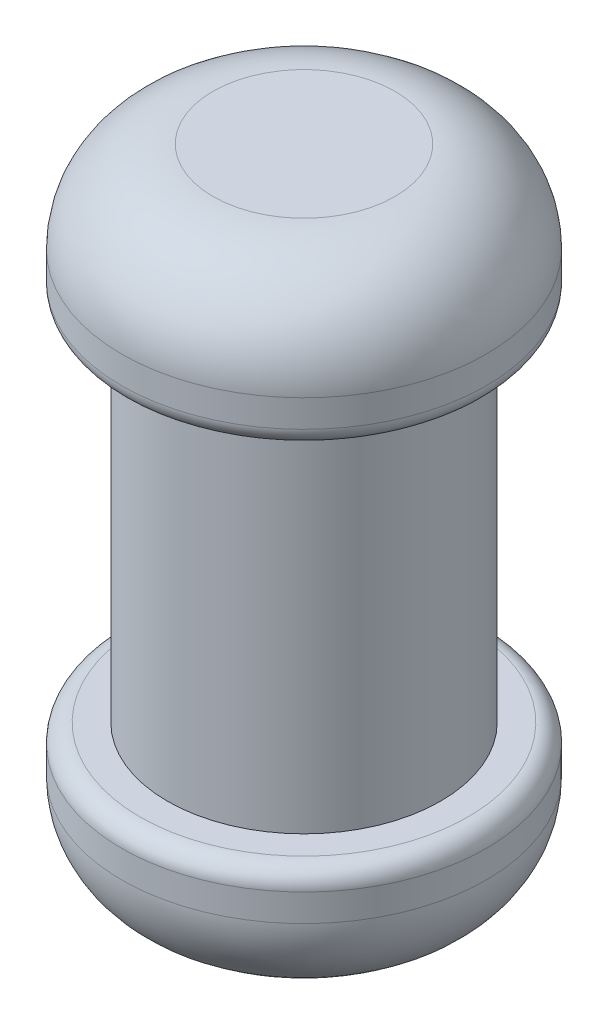
ISO-10303-21;
HEADER;
FILE_DESCRIPTION(('STEP AP214'),'2;1');
FILE_NAME('part.step','',(''),(''),'','','');
FILE_SCHEMA(('AUTOMOTIVE_DESIGN { 1 0 10303 214 1 1 1 1 }'));
ENDSEC;
DATA;
#1=APPLICATION_CONTEXT('core data for automotive mechanical design processes');
#2=APPLICATION_PROTOCOL_DEFINITION('international standard','automotive_design',2000,#1);
#3=PRODUCT_CONTEXT('',#1,'mechanical');
#4=PRODUCT('Part','Part','',(#3));
#5=PRODUCT_RELATED_PRODUCT_CATEGORY('part','',(#4));
#6=PRODUCT_DEFINITION_FORMATION('','',#4);
#7=PRODUCT_DEFINITION_CONTEXT('part definition',#1,'design');
#8=PRODUCT_DEFINITION('design','',#6,#7);
#9=PRODUCT_DEFINITION_SHAPE('','',#8);
#10=(LENGTH_UNIT() NAMED_UNIT(*) SI_UNIT(.MILLI.,.METRE.));
#11=(NAMED_UNIT(*) PLANE_ANGLE_UNIT() SI_UNIT($,.RADIAN.));
#12=(NAMED_UNIT(*) SI_UNIT($,.STERADIAN.) SOLID_ANGLE_UNIT());
#13=UNCERTAINTY_MEASURE_WITH_UNIT(LENGTH_MEASURE(1.E-05),#10,'distance_accuracy_value','');
#14=(GEOMETRIC_REPRESENTATION_CONTEXT(3) GLOBAL_UNCERTAINTY_ASSIGNED_CONTEXT((#13)) GLOBAL_UNIT_ASSIGNED_CONTEXT((#10,
#11,#12)) REPRESENTATION_CONTEXT('',''));
#15=CARTESIAN_POINT('',(0.,0.,0.));
#16=DIRECTION('',(0.,0.,1.));
#17=DIRECTION('',(1.,0.,0.));
#18=AXIS2_PLACEMENT_3D('',#15,#16,#17);
#19=CARTESIAN_POINT('',(0.,2.,0.));
#20=DIRECTION('',(0.,-1.,0.));
#21=DIRECTION('',(0.,0.,-1.));
#22=AXIS2_PLACEMENT_3D('',#19,#20,#21);
#23=CYLINDRICAL_SURFACE('',#22,1.5);
#24=CARTESIAN_POINT('',(0.,2.,0.));
#25=DIRECTION('',(0.,1.,0.));
#26=DIRECTION('',(0.,0.,1.));
#27=AXIS2_PLACEMENT_3D('',#24,#25,#26);
#28=CIRCLE('',#27,1.5);
#29=CARTESIAN_POINT('',(0.,2.,1.5));
#30=VERTEX_POINT('',#29);
#31=EDGE_CURVE('E62',#30,#30,#28,.T.);
#32=ORIENTED_EDGE('',*,*,#31,.F.);
#33=EDGE_LOOP('',(#32));
#34=FACE_BOUND('',#33,.T.);
#35=CARTESIAN_POINT('',(0.,-2.,0.));
#36=DIRECTION('',(0.,-1.,0.));
#37=DIRECTION('',(0.,0.,-1.));
#38=AXIS2_PLACEMENT_3D('',#35,#36,#37);
#39=CIRCLE('',#38,1.5);
#40=CARTESIAN_POINT('',(0.,-2.,-1.5));
#41=VERTEX_POINT('',#40);
#42=EDGE_CURVE('E65',#41,#41,#39,.T.);
#43=ORIENTED_EDGE('',*,*,#42,.F.);
#44=EDGE_LOOP('',(#43));
#45=FACE_BOUND('',#44,.T.);
#46=ADVANCED_FACE('F30',(#34,#45),#23,.T.);
#47=CARTESIAN_POINT('',(0.,2.,0.));
#48=DIRECTION('',(0.,1.,0.));
#49=DIRECTION('',(0.,0.,1.));
#50=AXIS2_PLACEMENT_3D('',#47,#48,#49);
#51=PLANE('',#50);
#52=CARTESIAN_POINT('',(0.,2.,0.));
#53=DIRECTION('',(0.,1.,0.));
#54=DIRECTION('',(0.,0.,1.));
#55=AXIS2_PLACEMENT_3D('',#52,#53,#54);
#56=CIRCLE('',#55,1.8);
#57=CARTESIAN_POINT('',(0.,2.,1.8));
#58=VERTEX_POINT('',#57);
#59=EDGE_CURVE('E50',#58,#58,#56,.F.);
#60=ORIENTED_EDGE('',*,*,#59,.T.);
#61=EDGE_LOOP('',(#60));
#62=FACE_BOUND('',#61,.T.);
#63=ORIENTED_EDGE('',*,*,#31,.T.);
#64=EDGE_LOOP('',(#63));
#65=FACE_BOUND('',#64,.T.);
#66=ADVANCED_FACE('F72',(#62,#65),#51,.F.);
#67=CARTESIAN_POINT('',(0.,3.5,0.));
#68=DIRECTION('',(0.,-1.,0.));
#69=DIRECTION('',(0.,0.,-1.));
#70=AXIS2_PLACEMENT_3D('',#67,#68,#69);
#71=CYLINDRICAL_SURFACE('',#70,2.);
#72=CARTESIAN_POINT('',(0.,2.2,0.));
#73=DIRECTION('',(0.,1.,0.));
#74=DIRECTION('',(0.,0.,1.));
#75=AXIS2_PLACEMENT_3D('',#72,#73,#74);
#76=CIRCLE('',#75,2.);
#77=CARTESIAN_POINT('',(0.,2.2,2.));
#78=VERTEX_POINT('',#77);
#79=EDGE_CURVE('E53',#78,#78,#76,.T.);
#80=ORIENTED_EDGE('',*,*,#79,.T.);
#81=EDGE_LOOP('',(#80));
#82=FACE_BOUND('',#81,.T.);
#83=CARTESIAN_POINT('',(0.,2.5,0.));
#84=DIRECTION('',(0.,1.,0.));
#85=DIRECTION('',(0.,0.,1.));
#86=AXIS2_PLACEMENT_3D('',#83,#84,#85);
#87=CIRCLE('',#86,2.);
#88=CARTESIAN_POINT('',(0.,2.5,2.));
#89=VERTEX_POINT('',#88);
#90=EDGE_CURVE('E56',#89,#89,#87,.F.);
#91=ORIENTED_EDGE('',*,*,#90,.T.);
#92=EDGE_LOOP('',(#91));
#93=FACE_BOUND('',#92,.T.);
#94=ADVANCED_FACE('F78',(#82,#93),#71,.T.);
#95=CARTESIAN_POINT('',(0.,3.5,0.));
#96=DIRECTION('',(0.,1.,0.));
#97=DIRECTION('',(0.,0.,1.));
#98=AXIS2_PLACEMENT_3D('',#95,#96,#97);
#99=PLANE('',#98);
#100=CARTESIAN_POINT('',(0.,3.5,0.));
#101=DIRECTION('',(0.,1.,0.));
#102=DIRECTION('',(0.,0.,1.));
#103=AXIS2_PLACEMENT_3D('',#100,#101,#102);
#104=CIRCLE('',#103,1.);
#105=CARTESIAN_POINT('',(0.,3.5,1.));
#106=VERTEX_POINT('',#105);
#107=EDGE_CURVE('E59',#106,#106,#104,.T.);
#108=ORIENTED_EDGE('',*,*,#107,.T.);
#109=EDGE_LOOP('',(#108));
#110=FACE_BOUND('',#109,.T.);
#111=ADVANCED_FACE('F88',(#110),#99,.T.);
#112=CARTESIAN_POINT('',(0.,2.5,0.));
#113=DIRECTION('',(0.,1.,0.));
#114=DIRECTION('',(0.,0.,1.));
#115=AXIS2_PLACEMENT_3D('',#112,#113,#114);
#116=DEGENERATE_TOROIDAL_SURFACE('',#115,1.,1.,.T.);
#117=ORIENTED_EDGE('',*,*,#90,.F.);
#118=EDGE_LOOP('',(#117));
#119=FACE_BOUND('',#118,.T.);
#120=ORIENTED_EDGE('',*,*,#107,.F.);
#121=EDGE_LOOP('',(#120));
#122=FACE_BOUND('',#121,.T.);
#123=ADVANCED_FACE('F84',(#119,#122),#116,.T.);
#124=CARTESIAN_POINT('',(0.,2.2,0.));
#125=DIRECTION('',(0.,1.,0.));
#126=DIRECTION('',(0.,0.,1.));
#127=AXIS2_PLACEMENT_3D('',#124,#125,#126);
#128=TOROIDAL_SURFACE('',#127,1.8,0.2);
#129=ORIENTED_EDGE('',*,*,#59,.F.);
#130=EDGE_LOOP('',(#129));
#131=FACE_BOUND('',#130,.T.);
#132=ORIENTED_EDGE('',*,*,#79,.F.);
#133=EDGE_LOOP('',(#132));
#134=FACE_BOUND('',#133,.T.);
#135=ADVANCED_FACE('F87',(#131,#134),#128,.T.);
#136=CARTESIAN_POINT('',(0.,-2.,0.));
#137=DIRECTION('',(0.,-1.,0.));
#138=DIRECTION('',(0.,0.,1.));
#139=AXIS2_PLACEMENT_3D('',#136,#137,#138);
#140=PLANE('',#139);
#141=CARTESIAN_POINT('',(0.,-2.,0.));
#142=DIRECTION('',(0.,-1.,0.));
#143=DIRECTION('',(0.,0.,-1.));
#144=AXIS2_PLACEMENT_3D('',#141,#142,#143);
#145=CIRCLE('',#144,1.8);
#146=CARTESIAN_POINT('',(0.,-2.,-1.8));
#147=VERTEX_POINT('',#146);
#148=EDGE_CURVE('E37',#147,#147,#145,.F.);
#149=ORIENTED_EDGE('',*,*,#148,.T.);
#150=EDGE_LOOP('',(#149));
#151=FACE_BOUND('',#150,.T.);
#152=ORIENTED_EDGE('',*,*,#42,.T.);
#153=EDGE_LOOP('',(#152));
#154=FACE_BOUND('',#153,.T.);
#155=ADVANCED_FACE('F69',(#151,#154),#140,.F.);
#156=CARTESIAN_POINT('',(0.,-3.5,0.));
#157=DIRECTION('',(0.,1.,0.));
#158=DIRECTION('',(0.,0.,1.));
#159=AXIS2_PLACEMENT_3D('',#156,#157,#158);
#160=CYLINDRICAL_SURFACE('',#159,2.);
#161=CARTESIAN_POINT('',(0.,-2.2,0.));
#162=DIRECTION('',(0.,-1.,0.));
#163=DIRECTION('',(0.,0.,-1.));
#164=AXIS2_PLACEMENT_3D('',#161,#162,#163);
#165=CIRCLE('',#164,2.);
#166=CARTESIAN_POINT('',(0.,-2.2,-2.));
#167=VERTEX_POINT('',#166);
#168=EDGE_CURVE('E10',#167,#167,#165,.T.);
#169=ORIENTED_EDGE('',*,*,#168,.T.);
#170=EDGE_LOOP('',(#169));
#171=FACE_BOUND('',#170,.T.);
#172=CARTESIAN_POINT('',(0.,-2.5,0.));
#173=DIRECTION('',(0.,-1.,0.));
#174=DIRECTION('',(0.,0.,-1.));
#175=AXIS2_PLACEMENT_3D('',#172,#173,#174);
#176=CIRCLE('',#175,2.);
#177=CARTESIAN_POINT('',(0.,-2.5,-2.));
#178=VERTEX_POINT('',#177);
#179=EDGE_CURVE('E45',#178,#178,#176,.F.);
#180=ORIENTED_EDGE('',*,*,#179,.T.);
#181=EDGE_LOOP('',(#180));
#182=FACE_BOUND('',#181,.T.);
#183=ADVANCED_FACE('F101',(#171,#182),#160,.T.);
#184=CARTESIAN_POINT('',(0.,-3.5,0.));
#185=DIRECTION('',(0.,-1.,0.));
#186=DIRECTION('',(0.,0.,1.));
#187=AXIS2_PLACEMENT_3D('',#184,#185,#186);
#188=PLANE('',#187);
#189=CARTESIAN_POINT('',(0.,-3.5,0.));
#190=DIRECTION('',(0.,-1.,0.));
#191=DIRECTION('',(0.,0.,-1.));
#192=AXIS2_PLACEMENT_3D('',#189,#190,#191);
#193=CIRCLE('',#192,1.);
#194=CARTESIAN_POINT('',(0.,-3.5,-1.));
#195=VERTEX_POINT('',#194);
#196=EDGE_CURVE('E41',#195,#195,#193,.T.);
#197=ORIENTED_EDGE('',*,*,#196,.T.);
#198=EDGE_LOOP('',(#197));
#199=FACE_BOUND('',#198,.T.);
#200=ADVANCED_FACE('F94',(#199),#188,.T.);
#201=CARTESIAN_POINT('',(0.,-2.5,0.));
#202=DIRECTION('',(0.,-1.,0.));
#203=DIRECTION('',(0.,0.,-1.));
#204=AXIS2_PLACEMENT_3D('',#201,#202,#203);
#205=DEGENERATE_TOROIDAL_SURFACE('',#204,1.,1.,.T.);
#206=ORIENTED_EDGE('',*,*,#196,.F.);
#207=EDGE_LOOP('',(#206));
#208=FACE_BOUND('',#207,.T.);
#209=ORIENTED_EDGE('',*,*,#179,.F.);
#210=EDGE_LOOP('',(#209));
#211=FACE_BOUND('',#210,.T.);
#212=ADVANCED_FACE('F92',(#208,#211),#205,.T.);
#213=CARTESIAN_POINT('',(0.,-2.2,0.));
#214=DIRECTION('',(0.,-1.,0.));
#215=DIRECTION('',(0.,0.,-1.));
#216=AXIS2_PLACEMENT_3D('',#213,#214,#215);
#217=TOROIDAL_SURFACE('',#216,1.8,0.2);
#218=ORIENTED_EDGE('',*,*,#168,.F.);
#219=EDGE_LOOP('',(#218));
#220=FACE_BOUND('',#219,.T.);
#221=ORIENTED_EDGE('',*,*,#148,.F.);
#222=EDGE_LOOP('',(#221));
#223=FACE_BOUND('',#222,.T.);
#224=ADVANCED_FACE('F32',(#220,#223),#217,.T.);
#225=CLOSED_SHELL('',(#46,#66,#94,#111,#123,#135,#155,#183,#200,#212,#224));
#226=MANIFOLD_SOLID_BREP('B2',#225);
#227=ADVANCED_BREP_SHAPE_REPRESENTATION('',(#18,#226),#14);
#228=SHAPE_DEFINITION_REPRESENTATION(#9,#227);
ENDSEC;
END-ISO-10303-21;
